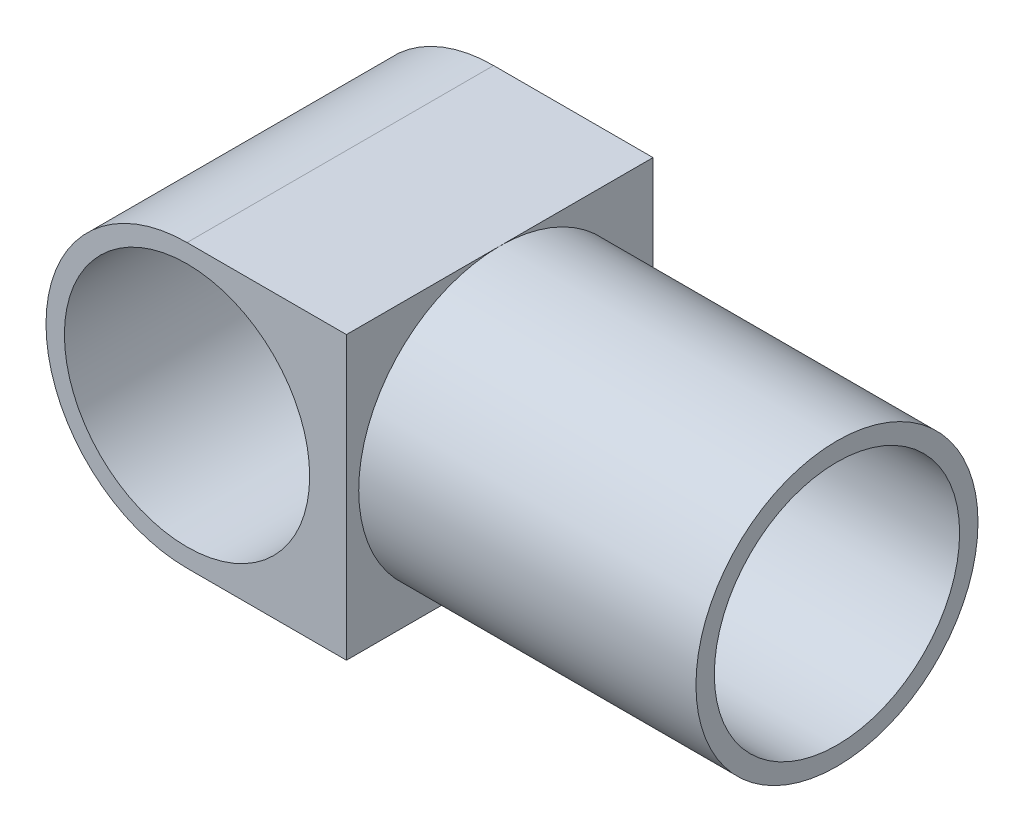
ISO-10303-21;
HEADER;
FILE_DESCRIPTION(('STEP AP214'),'2;1');
FILE_NAME('part.step','',(''),(''),'','','');
FILE_SCHEMA(('AUTOMOTIVE_DESIGN { 1 0 10303 214 1 1 1 1 }'));
ENDSEC;
DATA;
#1=APPLICATION_CONTEXT('core data for automotive mechanical design processes');
#2=APPLICATION_PROTOCOL_DEFINITION('international standard','automotive_design',2000,#1);
#3=PRODUCT_CONTEXT('',#1,'mechanical');
#4=PRODUCT('Part','Part','',(#3));
#5=PRODUCT_RELATED_PRODUCT_CATEGORY('part','',(#4));
#6=PRODUCT_DEFINITION_FORMATION('','',#4);
#7=PRODUCT_DEFINITION_CONTEXT('part definition',#1,'design');
#8=PRODUCT_DEFINITION('design','',#6,#7);
#9=PRODUCT_DEFINITION_SHAPE('','',#8);
#10=(LENGTH_UNIT() NAMED_UNIT(*) SI_UNIT(.MILLI.,.METRE.));
#11=(NAMED_UNIT(*) PLANE_ANGLE_UNIT() SI_UNIT($,.RADIAN.));
#12=(NAMED_UNIT(*) SI_UNIT($,.STERADIAN.) SOLID_ANGLE_UNIT());
#13=UNCERTAINTY_MEASURE_WITH_UNIT(LENGTH_MEASURE(1.E-05),#10,'distance_accuracy_value','');
#14=(GEOMETRIC_REPRESENTATION_CONTEXT(3) GLOBAL_UNCERTAINTY_ASSIGNED_CONTEXT((#13)) GLOBAL_UNIT_ASSIGNED_CONTEXT((#10,
#11,#12)) REPRESENTATION_CONTEXT('',''));
#15=CARTESIAN_POINT('',(0.,0.,0.));
#16=DIRECTION('',(0.,0.,1.));
#17=DIRECTION('',(1.,0.,0.));
#18=AXIS2_PLACEMENT_3D('',#15,#16,#17);
#19=CARTESIAN_POINT('',(13.,11.5,25.));
#20=DIRECTION('',(-1.,0.,0.));
#21=DIRECTION('',(0.,0.,1.));
#22=AXIS2_PLACEMENT_3D('',#19,#20,#21);
#23=PLANE('',#22);
#24=CARTESIAN_POINT('',(13.,0.,12.5));
#25=DIRECTION('',(1.,0.,0.));
#26=DIRECTION('',(0.,0.,-1.));
#27=AXIS2_PLACEMENT_3D('',#24,#25,#26);
#28=CIRCLE('',#27,11.5);
#29=CARTESIAN_POINT('',(13.,11.5,12.5));
#30=VERTEX_POINT('',#29);
#31=CARTESIAN_POINT('',(13.,-11.5,12.5));
#32=VERTEX_POINT('',#31);
#33=EDGE_CURVE('E52',#30,#32,#28,.T.);
#34=ORIENTED_EDGE('',*,*,#33,.F.);
#35=DIRECTION('',(0.,0.,-1.));
#36=VECTOR('',#35,1.);
#37=CARTESIAN_POINT('',(13.,11.5,25.));
#38=LINE('',#37,#36);
#39=CARTESIAN_POINT('',(13.,11.5,25.));
#40=VERTEX_POINT('',#39);
#41=EDGE_CURVE('E97',#40,#30,#38,.T.);
#42=ORIENTED_EDGE('',*,*,#41,.F.);
#43=DIRECTION('',(0.,1.,0.));
#44=VECTOR('',#43,1.);
#45=CARTESIAN_POINT('',(13.,11.5,25.));
#46=LINE('',#45,#44);
#47=CARTESIAN_POINT('',(13.,-11.5,25.));
#48=VERTEX_POINT('',#47);
#49=EDGE_CURVE('E181',#48,#40,#46,.T.);
#50=ORIENTED_EDGE('',*,*,#49,.F.);
#51=DIRECTION('',(0.,0.,-1.));
#52=VECTOR('',#51,1.);
#53=CARTESIAN_POINT('',(13.,-11.5,25.));
#54=LINE('',#53,#52);
#55=EDGE_CURVE('E114',#48,#32,#54,.T.);
#56=ORIENTED_EDGE('',*,*,#55,.T.);
#57=EDGE_LOOP('',(#34,#42,#50,#56));
#58=FACE_BOUND('',#57,.T.);
#59=ADVANCED_FACE('F41',(#58),#23,.F.);
#60=CARTESIAN_POINT('',(0.,0.,25.));
#61=DIRECTION('',(0.,0.,1.));
#62=DIRECTION('',(1.,0.,0.));
#63=AXIS2_PLACEMENT_3D('',#60,#61,#62);
#64=PLANE('',#63);
#65=CARTESIAN_POINT('',(0.,0.,25.));
#66=DIRECTION('',(0.,0.,1.));
#67=DIRECTION('',(1.,0.,0.));
#68=AXIS2_PLACEMENT_3D('',#65,#66,#67);
#69=CIRCLE('',#68,11.5);
#70=CARTESIAN_POINT('',(0.,11.5,25.));
#71=VERTEX_POINT('',#70);
#72=CARTESIAN_POINT('',(0.,-11.5,25.));
#73=VERTEX_POINT('',#72);
#74=EDGE_CURVE('E171',#71,#73,#69,.T.);
#75=ORIENTED_EDGE('',*,*,#74,.T.);
#76=DIRECTION('',(1.,0.,0.));
#77=VECTOR('',#76,1.);
#78=CARTESIAN_POINT('',(13.,-11.5,25.));
#79=LINE('',#78,#77);
#80=EDGE_CURVE('E93',#73,#48,#79,.T.);
#81=ORIENTED_EDGE('',*,*,#80,.T.);
#82=ORIENTED_EDGE('',*,*,#49,.T.);
#83=DIRECTION('',(-1.,0.,0.));
#84=VECTOR('',#83,1.);
#85=CARTESIAN_POINT('',(0.,11.5,25.));
#86=LINE('',#85,#84);
#87=EDGE_CURVE('E66',#40,#71,#86,.T.);
#88=ORIENTED_EDGE('',*,*,#87,.T.);
#89=EDGE_LOOP('',(#75,#81,#82,#88));
#90=FACE_BOUND('',#89,.T.);
#91=CARTESIAN_POINT('',(0.,0.,25.));
#92=DIRECTION('',(0.,0.,1.));
#93=DIRECTION('',(1.,0.,0.));
#94=AXIS2_PLACEMENT_3D('',#91,#92,#93);
#95=CIRCLE('',#94,10.);
#96=CARTESIAN_POINT('',(10.,0.,25.));
#97=VERTEX_POINT('',#96);
#98=EDGE_CURVE('E193',#97,#97,#95,.T.);
#99=ORIENTED_EDGE('',*,*,#98,.F.);
#100=EDGE_LOOP('',(#99));
#101=FACE_BOUND('',#100,.T.);
#102=ADVANCED_FACE('F138',(#90,#101),#64,.T.);
#103=CARTESIAN_POINT('',(0.,0.,0.));
#104=DIRECTION('',(0.,0.,1.));
#105=DIRECTION('',(1.,0.,0.));
#106=AXIS2_PLACEMENT_3D('',#103,#104,#105);
#107=PLANE('',#106);
#108=CARTESIAN_POINT('',(0.,0.,0.));
#109=DIRECTION('',(0.,0.,1.));
#110=DIRECTION('',(1.,0.,0.));
#111=AXIS2_PLACEMENT_3D('',#108,#109,#110);
#112=CIRCLE('',#111,11.5);
#113=CARTESIAN_POINT('',(0.,11.5,0.));
#114=VERTEX_POINT('',#113);
#115=CARTESIAN_POINT('',(0.,-11.5,0.));
#116=VERTEX_POINT('',#115);
#117=EDGE_CURVE('E165',#114,#116,#112,.T.);
#118=ORIENTED_EDGE('',*,*,#117,.F.);
#119=DIRECTION('',(-1.,0.,0.));
#120=VECTOR('',#119,1.);
#121=CARTESIAN_POINT('',(0.,11.5,0.));
#122=LINE('',#121,#120);
#123=CARTESIAN_POINT('',(13.,11.5,0.));
#124=VERTEX_POINT('',#123);
#125=EDGE_CURVE('E85',#124,#114,#122,.T.);
#126=ORIENTED_EDGE('',*,*,#125,.F.);
#127=DIRECTION('',(0.,1.,0.));
#128=VECTOR('',#127,1.);
#129=CARTESIAN_POINT('',(13.,11.5,0.));
#130=LINE('',#129,#128);
#131=CARTESIAN_POINT('',(13.,-11.5,0.));
#132=VERTEX_POINT('',#131);
#133=EDGE_CURVE('E109',#132,#124,#130,.T.);
#134=ORIENTED_EDGE('',*,*,#133,.F.);
#135=DIRECTION('',(1.,0.,0.));
#136=VECTOR('',#135,1.);
#137=CARTESIAN_POINT('',(13.,-11.5,0.));
#138=LINE('',#137,#136);
#139=EDGE_CURVE('E159',#116,#132,#138,.T.);
#140=ORIENTED_EDGE('',*,*,#139,.F.);
#141=EDGE_LOOP('',(#118,#126,#134,#140));
#142=FACE_BOUND('',#141,.T.);
#143=CARTESIAN_POINT('',(0.,0.,0.));
#144=DIRECTION('',(0.,0.,1.));
#145=DIRECTION('',(1.,0.,0.));
#146=AXIS2_PLACEMENT_3D('',#143,#144,#145);
#147=CIRCLE('',#146,10.);
#148=CARTESIAN_POINT('',(10.,0.,0.));
#149=VERTEX_POINT('',#148);
#150=EDGE_CURVE('E190',#149,#149,#147,.T.);
#151=ORIENTED_EDGE('',*,*,#150,.T.);
#152=EDGE_LOOP('',(#151));
#153=FACE_BOUND('',#152,.T.);
#154=ADVANCED_FACE('F143',(#142,#153),#107,.F.);
#155=CARTESIAN_POINT('',(0.,0.,25.));
#156=DIRECTION('',(0.,0.,-1.));
#157=DIRECTION('',(-1.,0.,0.));
#158=AXIS2_PLACEMENT_3D('',#155,#156,#157);
#159=CYLINDRICAL_SURFACE('',#158,11.5);
#160=ORIENTED_EDGE('',*,*,#117,.T.);
#161=DIRECTION('',(0.,0.,-1.));
#162=VECTOR('',#161,1.);
#163=CARTESIAN_POINT('',(0.,-11.5,25.));
#164=LINE('',#163,#162);
#165=EDGE_CURVE('E45',#73,#116,#164,.T.);
#166=ORIENTED_EDGE('',*,*,#165,.F.);
#167=ORIENTED_EDGE('',*,*,#74,.F.);
#168=DIRECTION('',(0.,0.,-1.));
#169=VECTOR('',#168,1.);
#170=CARTESIAN_POINT('',(0.,11.5,25.));
#171=LINE('',#170,#169);
#172=EDGE_CURVE('E111',#71,#114,#171,.T.);
#173=ORIENTED_EDGE('',*,*,#172,.T.);
#174=EDGE_LOOP('',(#160,#166,#167,#173));
#175=FACE_BOUND('',#174,.T.);
#176=ADVANCED_FACE('F43',(#175),#159,.T.);
#177=CARTESIAN_POINT('',(13.,-11.5,25.));
#178=DIRECTION('',(0.,1.,0.));
#179=DIRECTION('',(0.,0.,1.));
#180=AXIS2_PLACEMENT_3D('',#177,#178,#179);
#181=PLANE('',#180);
#182=ORIENTED_EDGE('',*,*,#139,.T.);
#183=EDGE_CURVE('E105',#32,#132,#54,.T.);
#184=ORIENTED_EDGE('',*,*,#183,.F.);
#185=ORIENTED_EDGE('',*,*,#55,.F.);
#186=ORIENTED_EDGE('',*,*,#80,.F.);
#187=ORIENTED_EDGE('',*,*,#165,.T.);
#188=EDGE_LOOP('',(#182,#184,#185,#186,#187));
#189=FACE_BOUND('',#188,.T.);
#190=ADVANCED_FACE('F149',(#189),#181,.F.);
#191=EDGE_CURVE('E11',#32,#30,#28,.T.);
#192=ORIENTED_EDGE('',*,*,#191,.F.);
#193=ORIENTED_EDGE('',*,*,#183,.T.);
#194=ORIENTED_EDGE('',*,*,#133,.T.);
#195=EDGE_CURVE('E99',#30,#124,#38,.T.);
#196=ORIENTED_EDGE('',*,*,#195,.F.);
#197=EDGE_LOOP('',(#192,#193,#194,#196));
#198=FACE_BOUND('',#197,.T.);
#199=ADVANCED_FACE('F107',(#198),#23,.F.);
#200=CARTESIAN_POINT('',(0.,11.5,25.));
#201=DIRECTION('',(0.,-1.,0.));
#202=DIRECTION('',(0.,0.,-1.));
#203=AXIS2_PLACEMENT_3D('',#200,#201,#202);
#204=PLANE('',#203);
#205=ORIENTED_EDGE('',*,*,#125,.T.);
#206=ORIENTED_EDGE('',*,*,#172,.F.);
#207=ORIENTED_EDGE('',*,*,#87,.F.);
#208=ORIENTED_EDGE('',*,*,#41,.T.);
#209=ORIENTED_EDGE('',*,*,#195,.T.);
#210=EDGE_LOOP('',(#205,#206,#207,#208,#209));
#211=FACE_BOUND('',#210,.T.);
#212=ADVANCED_FACE('F98',(#211),#204,.F.);
#213=CARTESIAN_POINT('',(0.,0.,25.));
#214=DIRECTION('',(0.,0.,-1.));
#215=DIRECTION('',(-1.,0.,0.));
#216=AXIS2_PLACEMENT_3D('',#213,#214,#215);
#217=CYLINDRICAL_SURFACE('',#216,10.);
#218=ORIENTED_EDGE('',*,*,#98,.T.);
#219=EDGE_LOOP('',(#218));
#220=FACE_BOUND('',#219,.T.);
#221=ORIENTED_EDGE('',*,*,#150,.F.);
#222=EDGE_LOOP('',(#221));
#223=FACE_BOUND('',#222,.T.);
#224=ADVANCED_FACE('F132',(#220,#223),#217,.F.);
#225=CARTESIAN_POINT('',(40.5,0.,12.5));
#226=DIRECTION('',(1.,0.,0.));
#227=DIRECTION('',(0.,0.,-1.));
#228=AXIS2_PLACEMENT_3D('',#225,#226,#227);
#229=PLANE('',#228);
#230=CARTESIAN_POINT('',(40.5,0.,12.5));
#231=DIRECTION('',(1.,0.,0.));
#232=DIRECTION('',(0.,0.,-1.));
#233=AXIS2_PLACEMENT_3D('',#230,#231,#232);
#234=CIRCLE('',#233,11.5);
#235=CARTESIAN_POINT('',(40.5,0.,1.));
#236=VERTEX_POINT('',#235);
#237=EDGE_CURVE('E117',#236,#236,#234,.T.);
#238=ORIENTED_EDGE('',*,*,#237,.T.);
#239=EDGE_LOOP('',(#238));
#240=FACE_BOUND('',#239,.T.);
#241=CARTESIAN_POINT('',(40.5,0.,12.5));
#242=DIRECTION('',(1.,0.,0.));
#243=DIRECTION('',(0.,0.,-1.));
#244=AXIS2_PLACEMENT_3D('',#241,#242,#243);
#245=CIRCLE('',#244,10.);
#246=CARTESIAN_POINT('',(40.5,0.,2.5));
#247=VERTEX_POINT('',#246);
#248=EDGE_CURVE('E118',#247,#247,#245,.T.);
#249=ORIENTED_EDGE('',*,*,#248,.F.);
#250=EDGE_LOOP('',(#249));
#251=FACE_BOUND('',#250,.T.);
#252=ADVANCED_FACE('F122',(#240,#251),#229,.T.);
#253=CARTESIAN_POINT('',(40.5,0.,12.5));
#254=DIRECTION('',(-1.,0.,0.));
#255=DIRECTION('',(0.,0.,1.));
#256=AXIS2_PLACEMENT_3D('',#253,#254,#255);
#257=CYLINDRICAL_SURFACE('',#256,11.5);
#258=ORIENTED_EDGE('',*,*,#237,.F.);
#259=EDGE_LOOP('',(#258));
#260=FACE_BOUND('',#259,.T.);
#261=ORIENTED_EDGE('',*,*,#33,.T.);
#262=ORIENTED_EDGE('',*,*,#191,.T.);
#263=EDGE_LOOP('',(#261,#262));
#264=FACE_BOUND('',#263,.T.);
#265=ADVANCED_FACE('F119',(#260,#264),#257,.T.);
#266=CARTESIAN_POINT('',(40.5,0.,12.5));
#267=DIRECTION('',(-1.,0.,0.));
#268=DIRECTION('',(0.,0.,1.));
#269=AXIS2_PLACEMENT_3D('',#266,#267,#268);
#270=CYLINDRICAL_SURFACE('',#269,10.);
#271=ORIENTED_EDGE('',*,*,#248,.T.);
#272=EDGE_LOOP('',(#271));
#273=FACE_BOUND('',#272,.T.);
#274=CARTESIAN_POINT('',(13.,0.,12.5));
#275=DIRECTION('',(1.,0.,0.));
#276=DIRECTION('',(0.,0.,-1.));
#277=AXIS2_PLACEMENT_3D('',#274,#275,#276);
#278=CIRCLE('',#277,10.);
#279=CARTESIAN_POINT('',(13.,0.,2.5));
#280=VERTEX_POINT('',#279);
#281=EDGE_CURVE('E204',#280,#280,#278,.T.);
#282=ORIENTED_EDGE('',*,*,#281,.F.);
#283=EDGE_LOOP('',(#282));
#284=FACE_BOUND('',#283,.T.);
#285=ADVANCED_FACE('F121',(#273,#284),#270,.F.);
#286=ORIENTED_EDGE('',*,*,#281,.T.);
#287=EDGE_LOOP('',(#286));
#288=FACE_BOUND('',#287,.T.);
#289=ADVANCED_FACE('F129',(#288),#23,.F.);
#290=CLOSED_SHELL('',(#59,#102,#154,#176,#190,#199,#212,#224,#252,#265,#285,#289));
#291=MANIFOLD_SOLID_BREP('B2',#290);
#292=ADVANCED_BREP_SHAPE_REPRESENTATION('',(#18,#291),#14);
#293=SHAPE_DEFINITION_REPRESENTATION(#9,#292);
ENDSEC;
END-ISO-10303-21;
